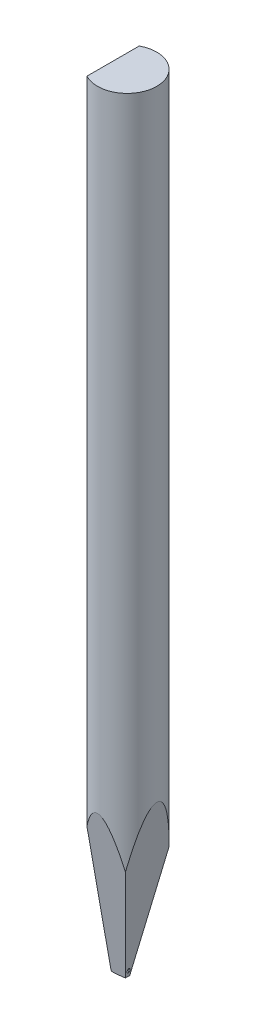
ISO-10303-21;
HEADER;
FILE_DESCRIPTION(('STEP AP214'),'2;1');
FILE_NAME('part.step','',(''),(''),'','','');
FILE_SCHEMA(('AUTOMOTIVE_DESIGN { 1 0 10303 214 1 1 1 1 }'));
ENDSEC;
DATA;
#1=APPLICATION_CONTEXT('core data for automotive mechanical design processes');
#2=APPLICATION_PROTOCOL_DEFINITION('international standard','automotive_design',2000,#1);
#3=PRODUCT_CONTEXT('',#1,'mechanical');
#4=PRODUCT('Part','Part','',(#3));
#5=PRODUCT_RELATED_PRODUCT_CATEGORY('part','',(#4));
#6=PRODUCT_DEFINITION_FORMATION('','',#4);
#7=PRODUCT_DEFINITION_CONTEXT('part definition',#1,'design');
#8=PRODUCT_DEFINITION('design','',#6,#7);
#9=PRODUCT_DEFINITION_SHAPE('','',#8);
#10=(LENGTH_UNIT() NAMED_UNIT(*) SI_UNIT(.MILLI.,.METRE.));
#11=(NAMED_UNIT(*) PLANE_ANGLE_UNIT() SI_UNIT($,.RADIAN.));
#12=(NAMED_UNIT(*) SI_UNIT($,.STERADIAN.) SOLID_ANGLE_UNIT());
#13=UNCERTAINTY_MEASURE_WITH_UNIT(LENGTH_MEASURE(1.E-05),#10,'distance_accuracy_value','');
#14=(GEOMETRIC_REPRESENTATION_CONTEXT(3) GLOBAL_UNCERTAINTY_ASSIGNED_CONTEXT((#13)) GLOBAL_UNIT_ASSIGNED_CONTEXT((#10,
#11,#12)) REPRESENTATION_CONTEXT('',''));
#15=CARTESIAN_POINT('',(0.,0.,0.));
#16=DIRECTION('',(0.,0.,1.));
#17=DIRECTION('',(1.,0.,0.));
#18=AXIS2_PLACEMENT_3D('',#15,#16,#17);
#19=CARTESIAN_POINT('',(-0.24892,0.,27.2760283406468));
#20=DIRECTION('',(-0.139173100960066,0.99026806874157,0.));
#21=DIRECTION('',(-0.99026806874157,-0.139173100960066,0.));
#22=AXIS2_PLACEMENT_3D('',#19,#20,#21);
#23=PLANE('',#22);
#24=DIRECTION('',(-0.99026806874157,-0.139173100960066,0.));
#25=VECTOR('',#24,1.);
#26=CARTESIAN_POINT('',(-0.24892,0.,0.0253999999999983));
#27=LINE('',#26,#25);
#28=CARTESIAN_POINT('',(-0.127,0.0171347385669156,0.0253999999999992));
#29=VERTEX_POINT('',#28);
#30=CARTESIAN_POINT('',(-0.229291435266472,0.00275861487165983,0.0254));
#31=VERTEX_POINT('',#30);
#32=EDGE_CURVE('E183',#29,#31,#27,.T.);
#33=ORIENTED_EDGE('',*,*,#32,.F.);
#34=DIRECTION('',(0.,0.,1.));
#35=VECTOR('',#34,1.);
#36=CARTESIAN_POINT('',(-0.127,0.0171347385669156,27.2760283406468));
#37=LINE('',#36,#35);
#38=CARTESIAN_POINT('',(-0.127,0.0171347385669156,-0.0253999999999992));
#39=VERTEX_POINT('',#38);
#40=EDGE_CURVE('E11',#39,#29,#37,.T.);
#41=ORIENTED_EDGE('',*,*,#40,.F.);
#42=DIRECTION('',(-0.99026806874157,-0.139173100960066,0.));
#43=VECTOR('',#42,1.);
#44=CARTESIAN_POINT('',(-0.24892,0.,-0.0253999999999983));
#45=LINE('',#44,#43);
#46=CARTESIAN_POINT('',(-0.229291435266472,0.00275861487165983,-0.0254));
#47=VERTEX_POINT('',#46);
#48=EDGE_CURVE('E147',#39,#47,#45,.T.);
#49=ORIENTED_EDGE('',*,*,#48,.T.);
#50=CARTESIAN_POINT('',(-2.40864817183527,-0.30353,0.));
#51=DIRECTION('',(-0.139173100960066,0.99026806874157,0.));
#52=DIRECTION('',(-0.99026806874157,-0.139173100960066,0.));
#53=AXIS2_PLACEMENT_3D('',#50,#51,#52);
#54=ELLIPSE('',#53,2.20832903686027,0.30734);
#55=CARTESIAN_POINT('',(-0.24892,0.,-0.0482432865795852));
#56=VERTEX_POINT('',#55);
#57=EDGE_CURVE('E189',#47,#56,#54,.T.);
#58=ORIENTED_EDGE('',*,*,#57,.T.);
#59=DIRECTION('',(0.,0.,-1.));
#60=VECTOR('',#59,1.);
#61=CARTESIAN_POINT('',(-0.24892,0.,27.2760283406468));
#62=LINE('',#61,#60);
#63=CARTESIAN_POINT('',(-0.248920000000001,0.,-0.0508000000000001));
#64=VERTEX_POINT('',#63);
#65=EDGE_CURVE('E207',#56,#64,#62,.T.);
#66=ORIENTED_EDGE('',*,*,#65,.T.);
#67=DIRECTION('',(0.98997002855162,0.139131214142995,-0.0245325869121374));
#68=VECTOR('',#67,1.);
#69=CARTESIAN_POINT('',(26.3325188531676,3.73577760401477,-0.709518385514232));
#70=LINE('',#69,#68);
#71=CARTESIAN_POINT('',(0.0115343561363234,0.0366044726132731,-0.0572543561363242));
#72=VERTEX_POINT('',#71);
#73=EDGE_CURVE('E249',#64,#72,#70,.T.);
#74=ORIENTED_EDGE('',*,*,#73,.T.);
#75=DIRECTION('',(0.,0.,-1.));
#76=VECTOR('',#75,1.);
#77=CARTESIAN_POINT('',(0.0115343561363241,0.036604472613273,27.2760283406468));
#78=LINE('',#77,#76);
#79=CARTESIAN_POINT('',(0.0115343561363234,0.0366044726132731,0.0572543561363242));
#80=VERTEX_POINT('',#79);
#81=EDGE_CURVE('E204',#80,#72,#78,.T.);
#82=ORIENTED_EDGE('',*,*,#81,.F.);
#83=DIRECTION('',(-0.98997002855162,-0.139131214142995,-0.0245325869121374));
#84=VECTOR('',#83,1.);
#85=CARTESIAN_POINT('',(26.3325188531676,3.73577760401477,0.709518385514232));
#86=LINE('',#85,#84);
#87=CARTESIAN_POINT('',(-0.248920000000001,0.,0.0508000000000001));
#88=VERTEX_POINT('',#87);
#89=EDGE_CURVE('E217',#80,#88,#86,.T.);
#90=ORIENTED_EDGE('',*,*,#89,.T.);
#91=CARTESIAN_POINT('',(-0.24892,0.,0.0482432865795852));
#92=VERTEX_POINT('',#91);
#93=EDGE_CURVE('E208',#88,#92,#62,.T.);
#94=ORIENTED_EDGE('',*,*,#93,.T.);
#95=EDGE_CURVE('E191',#92,#31,#54,.T.);
#96=ORIENTED_EDGE('',*,*,#95,.T.);
#97=EDGE_LOOP('',(#33,#41,#49,#58,#66,#74,#82,#90,#94,#96));
#98=FACE_BOUND('',#97,.T.);
#99=ADVANCED_FACE('F43',(#98),#23,.F.);
#100=CARTESIAN_POINT('',(26.8421219491216,-0.30353,0.));
#101=DIRECTION('',(-1.,0.,0.));
#102=DIRECTION('',(0.,0.,1.));
#103=AXIS2_PLACEMENT_3D('',#100,#101,#102);
#104=CYLINDRICAL_SURFACE('',#103,0.30734);
#105=DIRECTION('',(-1.,0.,0.));
#106=VECTOR('',#105,1.);
#107=CARTESIAN_POINT('',(26.8421219491216,0.00275861487165983,0.0254));
#108=LINE('',#107,#106);
#109=CARTESIAN_POINT('',(-0.263296988873611,0.00275861487166304,0.0254));
#110=VERTEX_POINT('',#109);
#111=EDGE_CURVE('E51',#31,#110,#108,.T.);
#112=ORIENTED_EDGE('',*,*,#111,.F.);
#113=ORIENTED_EDGE('',*,*,#95,.F.);
#114=DIRECTION('',(-1.,0.,0.));
#115=VECTOR('',#114,1.);
#116=CARTESIAN_POINT('',(26.8421219491216,0.,0.0482432865795852));
#117=LINE('',#116,#115);
#118=CARTESIAN_POINT('',(-0.35052,0.,0.0482432865795794));
#119=VERTEX_POINT('',#118);
#120=EDGE_CURVE('E66',#92,#119,#117,.T.);
#121=ORIENTED_EDGE('',*,*,#120,.T.);
#122=CARTESIAN_POINT('',(-0.35052,0.,-0.0482432865795922));
#123=CARTESIAN_POINT('',(-0.350767913301095,-1.1954284377854E-07,-0.048243986655547));
#124=CARTESIAN_POINT('',(-0.351014861392933,3.62470794983104E-06,-0.048220483758382));
#125=CARTESIAN_POINT('',(-0.351497824475881,1.77257610530524E-05,-0.0481316635507885));
#126=CARTESIAN_POINT('',(-0.351733938449228,2.79980345508149E-05,-0.0480668807295797));
#127=CARTESIAN_POINT('',(-0.352256326088675,5.7700596975821E-05,-0.0478789541586123));
#128=CARTESIAN_POINT('',(-0.352538394385228,7.88787351782363E-05,-0.047744619946916));
#129=CARTESIAN_POINT('',(-0.353078295346922,0.000127703558985957,-0.0474331108524054));
#130=CARTESIAN_POINT('',(-0.353335984553504,0.000155385552449555,-0.0472557019452803));
#131=CARTESIAN_POINT('',(-0.35400174233734,0.000236174594357564,-0.0467343071530911));
#132=CARTESIAN_POINT('',(-0.354386489991853,0.000293366747035748,-0.04636155839518));
#133=CARTESIAN_POINT('',(-0.355098951579075,0.000413574680164979,-0.0455669319559005));
#134=CARTESIAN_POINT('',(-0.355426537167256,0.000476603091413922,-0.0451449471799635));
#135=CARTESIAN_POINT('',(-0.356612086855197,0.000724574718518985,-0.0434579803018282));
#136=CARTESIAN_POINT('',(-0.357318341338529,0.000917424822642262,-0.0420900984298431));
#137=CARTESIAN_POINT('',(-0.358546499103956,0.00129385703696158,-0.0392733364497363));
#138=CARTESIAN_POINT('',(-0.359067131306758,0.00147736813627271,-0.0378239736930998));
#139=CARTESIAN_POINT('',(-0.361082963556257,0.00223677886764565,-0.0314441024489371));
#140=CARTESIAN_POINT('',(-0.361998491462296,0.00272303861932417,-0.0263250556700667));
#141=CARTESIAN_POINT('',(-0.363287466260709,0.00343648568054139,-0.0160225561821167));
#142=CARTESIAN_POINT('',(-0.363659578270333,0.00366303472730859,-0.0108389763128923));
#143=CARTESIAN_POINT('',(-0.363972985043323,0.0038533013861436,-0.000449493392455334));
#144=CARTESIAN_POINT('',(-0.363914353724791,0.00381706409391488,0.0047564056754146));
#145=CARTESIAN_POINT('',(-0.363359645903478,0.00348101396992449,0.0151346555748685));
#146=CARTESIAN_POINT('',(-0.362863906204432,0.00318140407435992,0.0203070291482927));
#147=CARTESIAN_POINT('',(-0.361587863461912,0.00253284401461593,0.0281196828661384));
#148=CARTESIAN_POINT('',(-0.361052170464872,0.00227386598671672,0.0308032472057591));
#149=CARTESIAN_POINT('',(-0.359879874536833,0.00178202258087566,0.035298540975975));
#150=CARTESIAN_POINT('',(-0.359320212463204,0.00156415994286525,0.037132976562585));
#151=CARTESIAN_POINT('',(-0.357915449615094,0.00108653420359277,0.0408693960879644));
#152=CARTESIAN_POINT('',(-0.357051905851088,0.000824845821214569,0.0427659366927868));
#153=CARTESIAN_POINT('',(-0.355666955135468,0.000526022910361374,0.0448100132221754));
#154=CARTESIAN_POINT('',(-0.355427139387405,0.000477218188451427,0.0451397061499284));
#155=CARTESIAN_POINT('',(-0.354916645564496,0.000382020953423657,0.0457761949331294));
#156=CARTESIAN_POINT('',(-0.35464590420184,0.00033563368038394,0.0460829416292439));
#157=CARTESIAN_POINT('',(-0.354064289185938,0.000246758191852077,0.0466652445212367));
#158=CARTESIAN_POINT('',(-0.353752942125968,0.000204328109507224,0.046940346423817));
#159=CARTESIAN_POINT('',(-0.353086480397466,0.000127793869629602,0.0474329155161212));
#160=CARTESIAN_POINT('',(-0.352731561443883,9.36543940548731E-05,0.0476506275388511));
#161=CARTESIAN_POINT('',(-0.352132978988947,5.02841505668838E-05,0.0479259603811172));
#162=CARTESIAN_POINT('',(-0.351903112512633,3.65754200280905E-05,0.0480126464944076));
#163=CARTESIAN_POINT('',(-0.351432234922693,1.53075235903079E-05,0.0481469291864223));
#164=CARTESIAN_POINT('',(-0.351191258260091,7.73054276190169E-06,0.0481946390090961));
#165=CARTESIAN_POINT('',(-0.350805892270718,1.19685939589671E-06,0.0482357533750448));
#166=CARTESIAN_POINT('',(-0.350662956582401,-3.31045745124852E-08,0.04824348277755));
#167=CARTESIAN_POINT('',(-0.350520000000001,0.,0.0482432865795857));
#168=B_SPLINE_CURVE_WITH_KNOTS('',3,(#122,#123,#124,#125,#126,#127,#128,#129,#130,#131,#132,
#133,#134,#135,#136,#137,#138,#139,#140,#141,#142,#143,#144,#145,#146,#147,#148,#149,#150,#151,
#152,#153,#154,#155,#156,#157,#158,#159,#160,#161,#162,#163,#164,#165,#166,#167),.UNSPECIFIED.,
.F.,.F.,(4,2,2,2,2,2,2,2,2,2,2,2,2,2,2,2,2,2,2,2,2,2,4),(0.,0.000741043318305509,
0.00147268140779471,0.00240682725086905,0.00334616655925005,0.00495326023235513,
0.00656391709747349,0.0111818210056003,0.0158307654682399,0.0313880221471919,0.0469834307890319,
0.0625761632290504,0.0781568915394562,0.0863865542979414,0.0921775559521106,0.0984081610415071,
0.0996385359492031,0.100871475463097,0.102120347956795,0.103363803055086,0.10409917629346,
0.104832405260402,0.105261095012052),.UNSPECIFIED.);
#169=CARTESIAN_POINT('',(-0.350519999999986,0.,-0.0482432865795852));
#170=VERTEX_POINT('',#169);
#171=EDGE_CURVE('E255',#170,#119,#168,.T.);
#172=ORIENTED_EDGE('',*,*,#171,.F.);
#173=DIRECTION('',(-1.,0.,0.));
#174=VECTOR('',#173,1.);
#175=CARTESIAN_POINT('',(26.8421219491216,0.,-0.0482432865795852));
#176=LINE('',#175,#174);
#177=EDGE_CURVE('E186',#56,#170,#176,.T.);
#178=ORIENTED_EDGE('',*,*,#177,.F.);
#179=ORIENTED_EDGE('',*,*,#57,.F.);
#180=DIRECTION('',(-1.,0.,0.));
#181=VECTOR('',#180,1.);
#182=CARTESIAN_POINT('',(26.8421219491216,0.00275861487165983,-0.0254));
#183=LINE('',#182,#181);
#184=CARTESIAN_POINT('',(-0.263296988873611,0.00275861487166211,-0.0254));
#185=VERTEX_POINT('',#184);
#186=EDGE_CURVE('E263',#47,#185,#183,.T.);
#187=ORIENTED_EDGE('',*,*,#186,.T.);
#188=CARTESIAN_POINT('',(-0.263296988873615,0.00275861487166541,-0.0254));
#189=CARTESIAN_POINT('',(-0.265444430405985,0.00275787671528225,-0.0253998771308304));
#190=CARTESIAN_POINT('',(-0.267597732028354,0.00277298530645061,-0.0252260953476512));
#191=CARTESIAN_POINT('',(-0.271856159600567,0.00283121514116066,-0.0245140453953919));
#192=CARTESIAN_POINT('',(-0.273960891965895,0.002874513966082,-0.0239734657049874));
#193=CARTESIAN_POINT('',(-0.277621450558486,0.00297415080728848,-0.0226581646183291));
#194=CARTESIAN_POINT('',(-0.279202223395719,0.00302608298732994,-0.0219528740536527));
#195=CARTESIAN_POINT('',(-0.282224279791113,0.00314031874074109,-0.020294996738451));
#196=CARTESIAN_POINT('',(-0.2836659614516,0.0032025912365653,-0.019343146355839));
#197=CARTESIAN_POINT('',(-0.286136351426538,0.00332011935603135,-0.0173691432443158));
#198=CARTESIAN_POINT('',(-0.28719411931051,0.00337487582877369,-0.0163834060277853));
#199=CARTESIAN_POINT('',(-0.289133435386785,0.00348134304003128,-0.0142495600312407));
#200=CARTESIAN_POINT('',(-0.290014961277573,0.00353305339250982,-0.0131014307336158));
#201=CARTESIAN_POINT('',(-0.291564032014947,0.00362763657878561,-0.0106566504876356));
#202=CARTESIAN_POINT('',(-0.292230131024491,0.00367044903655593,-0.00935907216897192));
#203=CARTESIAN_POINT('',(-0.293300028293608,0.0037407949631982,-0.0066594395319361));
#204=CARTESIAN_POINT('',(-0.293704045068021,0.0037683411577385,-0.00525747333863506));
#205=CARTESIAN_POINT('',(-0.294191208474051,0.00380177700804993,-0.00257512047659103));
#206=CARTESIAN_POINT('',(-0.294307427080704,0.00380989467913992,-0.00130070779819515));
#207=CARTESIAN_POINT('',(-0.294310458738467,0.00381010307647609,0.00124816111540355));
#208=CARTESIAN_POINT('',(-0.294197359652917,0.00380219994111317,0.00252261714690147));
#209=CARTESIAN_POINT('',(-0.293761327057917,0.00377227202855003,0.00495889317186551));
#210=CARTESIAN_POINT('',(-0.29345079592914,0.00375108287767713,0.00612298167055895));
#211=CARTESIAN_POINT('',(-0.29264678761112,0.00369766813586478,0.00838554438941615));
#212=CARTESIAN_POINT('',(-0.292153296574228,0.00366544170956345,0.00948401363576038));
#213=CARTESIAN_POINT('',(-0.290979940775483,0.00359159572869652,0.0116366413861173));
#214=CARTESIAN_POINT('',(-0.290293056069098,0.00354963561612976,0.0126869416901583));
#215=CARTESIAN_POINT('',(-0.288770430851901,0.00346116467833494,0.0146727846946988));
#216=CARTESIAN_POINT('',(-0.287934633065107,0.00341465210522114,0.0156082830046169));
#217=CARTESIAN_POINT('',(-0.286034323531791,0.00331531896242708,0.0174580910740619));
#218=CARTESIAN_POINT('',(-0.284954419418413,0.00326240821162118,0.0183565395392816));
#219=CARTESIAN_POINT('',(-0.282677675190383,0.00316031129225174,0.0199899762242416));
#220=CARTESIAN_POINT('',(-0.281480778340052,0.00311112695154115,0.0207248845634112));
#221=CARTESIAN_POINT('',(-0.278792581688037,0.00301243060223684,0.0221404867419703));
#222=CARTESIAN_POINT('',(-0.277285581151682,0.00296424837308401,0.0227913928023827));
#223=CARTESIAN_POINT('',(-0.274194177115432,0.00288175486882891,0.0238748004063647));
#224=CARTESIAN_POINT('',(-0.272609709788392,0.00284745525547335,0.0243071184061134));
#225=CARTESIAN_POINT('',(-0.269734939528156,0.0028004733226307,0.0248914653993343));
#226=CARTESIAN_POINT('',(-0.268452513348957,0.00278476835336049,0.0250832300682597));
#227=CARTESIAN_POINT('',(-0.265878958116572,0.00276381915932508,0.0253372121777127));
#228=CARTESIAN_POINT('',(-0.264587871042221,0.00275854101257999,0.0253998497414434));
#229=CARTESIAN_POINT('',(-0.263296988875001,0.00275861487110465,0.0254000000067783));
#230=B_SPLINE_CURVE_WITH_KNOTS('',3,(#188,#189,#190,#191,#192,#193,#194,#195,#196,#197,#198,
#199,#200,#201,#202,#203,#204,#205,#206,#207,#208,#209,#210,#211,#212,#213,#214,#215,#216,#217,
#218,#219,#220,#221,#222,#223,#224,#225,#226,#227,#228,#229),.UNSPECIFIED.,.F.,.F.,(4,2,2,2,2,2,
2,2,2,2,2,2,2,2,2,2,2,2,2,2,4),(0.,0.00644508279910896,0.0129311637490576,0.0181059616421331,
0.0232654793449091,0.0275885263307984,0.0319121200056632,0.0362641566953633,0.0406125601319729,
0.0444316470545828,0.0482492709661122,0.0518480159838007,0.0554470334345733,0.0591987706886136,
0.0629519540893285,0.0671531844215516,0.0713564623468416,0.0762650208194602,0.08117769408951,
0.0850616737339232,0.0889329965320814),.UNSPECIFIED.);
#231=EDGE_CURVE('E278',#185,#110,#230,.T.);
#232=ORIENTED_EDGE('',*,*,#231,.T.);
#233=EDGE_LOOP('',(#112,#113,#121,#172,#178,#179,#187,#232));
#234=FACE_BOUND('',#233,.T.);
#235=ADVANCED_FACE('F268',(#234),#104,.F.);
#236=CARTESIAN_POINT('',(0.,0.,0.));
#237=DIRECTION('',(0.,1.,0.));
#238=DIRECTION('',(0.,0.,1.));
#239=AXIS2_PLACEMENT_3D('',#236,#237,#238);
#240=PLANE('',#239);
#241=ORIENTED_EDGE('',*,*,#120,.F.);
#242=ORIENTED_EDGE('',*,*,#93,.F.);
#243=DIRECTION('',(-1.,0.,0.));
#244=VECTOR('',#243,1.);
#245=CARTESIAN_POINT('',(26.8738719491216,0.,0.0508));
#246=LINE('',#245,#244);
#247=CARTESIAN_POINT('',(-0.35052,0.,0.0507999999999983));
#248=VERTEX_POINT('',#247);
#249=EDGE_CURVE('E220',#88,#248,#246,.T.);
#250=ORIENTED_EDGE('',*,*,#249,.T.);
#251=DIRECTION('',(0.,0.,-1.));
#252=VECTOR('',#251,1.);
#253=CARTESIAN_POINT('',(-0.35052,0.,26.4674719491216));
#254=LINE('',#253,#252);
#255=EDGE_CURVE('E195',#248,#119,#254,.T.);
#256=ORIENTED_EDGE('',*,*,#255,.T.);
#257=EDGE_LOOP('',(#241,#242,#250,#256));
#258=FACE_BOUND('',#257,.T.);
#259=ADVANCED_FACE('F272',(#258),#240,.F.);
#260=CARTESIAN_POINT('',(26.8738719491216,0.,0.0508));
#261=DIRECTION('',(0.,-0.173648177666931,0.984807753012208));
#262=DIRECTION('',(0.,-0.984807753012208,-0.173648177666931));
#263=AXIS2_PLACEMENT_3D('',#260,#261,#262);
#264=PLANE('',#263);
#265=CARTESIAN_POINT('',(-0.35052,0.0254,0.0552787053099933));
#266=DIRECTION('',(0.,-0.173648177666931,0.984807753012208));
#267=DIRECTION('',(0.,-0.984807753012208,-0.173648177666931));
#268=AXIS2_PLACEMENT_3D('',#265,#266,#267);
#269=ELLIPSE('',#268,0.0257918359418979,0.0254);
#270=CARTESIAN_POINT('',(-0.37592,0.0254,0.0552787053099933));
#271=VERTEX_POINT('',#270);
#272=EDGE_CURVE('E198',#248,#271,#269,.F.);
#273=ORIENTED_EDGE('',*,*,#272,.F.);
#274=ORIENTED_EDGE('',*,*,#249,.F.);
#275=ORIENTED_EDGE('',*,*,#89,.F.);
#276=DIRECTION('',(-0.171087869746036,-0.970287525247814,-0.171087869746036));
#277=VECTOR('',#276,1.);
#278=CARTESIAN_POINT('',(0.791557999082988,4.46033837772866,0.837277999082991));
#279=LINE('',#278,#277);
#280=CARTESIAN_POINT('',(0.537041505266772,3.01690361355591,0.582761505266774));
#281=VERTEX_POINT('',#280);
#282=EDGE_CURVE('E214',#281,#80,#279,.T.);
#283=ORIENTED_EDGE('',*,*,#282,.F.);
#284=CARTESIAN_POINT('',(0.,-0.288101116436578,0.));
#285=DIRECTION('',(0.,-0.173648177666931,0.984807753012208));
#286=DIRECTION('',(0.,-0.984807753012208,-0.173648177666931));
#287=AXIS2_PLACEMENT_3D('',#284,#285,#286);
#288=ELLIPSE('',#287,4.56371043248163,0.792479999999998);
#289=CARTESIAN_POINT('',(-0.37592,3.66844093071414,0.69764511322018));
#290=VERTEX_POINT('',#289);
#291=EDGE_CURVE('E226',#281,#290,#288,.T.);
#292=ORIENTED_EDGE('',*,*,#291,.T.);
#293=DIRECTION('',(0.,0.984807753012208,0.173648177666931));
#294=VECTOR('',#293,1.);
#295=CARTESIAN_POINT('',(-0.37592,20.2093857917021,3.6142599786234));
#296=LINE('',#295,#294);
#297=EDGE_CURVE('E241',#271,#290,#296,.T.);
#298=ORIENTED_EDGE('',*,*,#297,.F.);
#299=EDGE_LOOP('',(#273,#274,#275,#283,#292,#298));
#300=FACE_BOUND('',#299,.T.);
#301=ADVANCED_FACE('F304',(#300),#264,.T.);
#302=CARTESIAN_POINT('',(26.8738719491216,0.,-0.0508));
#303=DIRECTION('',(0.,-0.173648177666931,-0.984807753012208));
#304=DIRECTION('',(0.,0.984807753012208,-0.173648177666931));
#305=AXIS2_PLACEMENT_3D('',#302,#303,#304);
#306=PLANE('',#305);
#307=CARTESIAN_POINT('',(-0.35052,0.0254,-0.0552787053099933));
#308=DIRECTION('',(0.,-0.173648177666931,-0.984807753012208));
#309=DIRECTION('',(0.,0.984807753012208,-0.173648177666931));
#310=AXIS2_PLACEMENT_3D('',#307,#308,#309);
#311=ELLIPSE('',#310,0.0257918359418979,0.0254);
#312=CARTESIAN_POINT('',(-0.37592,0.0254,-0.0552787053099933));
#313=VERTEX_POINT('',#312);
#314=CARTESIAN_POINT('',(-0.35052,0.,-0.0508000000000002));
#315=VERTEX_POINT('',#314);
#316=EDGE_CURVE('E252',#313,#315,#311,.F.);
#317=ORIENTED_EDGE('',*,*,#316,.F.);
#318=DIRECTION('',(0.,-0.984807753012208,0.173648177666931));
#319=VECTOR('',#318,1.);
#320=CARTESIAN_POINT('',(-0.37592,20.5673030312895,-3.67737044482337));
#321=LINE('',#320,#319);
#322=CARTESIAN_POINT('',(-0.37592,3.66844093071414,-0.69764511322018));
#323=VERTEX_POINT('',#322);
#324=EDGE_CURVE('E243',#323,#313,#321,.T.);
#325=ORIENTED_EDGE('',*,*,#324,.F.);
#326=CARTESIAN_POINT('',(0.,-0.288101116436578,0.));
#327=DIRECTION('',(0.,-0.173648177666931,-0.984807753012208));
#328=DIRECTION('',(0.,-0.984807753012208,0.173648177666931));
#329=AXIS2_PLACEMENT_3D('',#326,#327,#328);
#330=ELLIPSE('',#329,4.56371043248163,0.792479999999998);
#331=CARTESIAN_POINT('',(0.537041505266772,3.01690361355591,-0.582761505266774));
#332=VERTEX_POINT('',#331);
#333=EDGE_CURVE('E229',#323,#332,#330,.T.);
#334=ORIENTED_EDGE('',*,*,#333,.T.);
#335=DIRECTION('',(0.171087869746036,0.970287525247814,-0.171087869746036));
#336=VECTOR('',#335,1.);
#337=CARTESIAN_POINT('',(0.791557999082988,4.46033837772866,-0.837277999082991));
#338=LINE('',#337,#336);
#339=EDGE_CURVE('E246',#72,#332,#338,.T.);
#340=ORIENTED_EDGE('',*,*,#339,.F.);
#341=ORIENTED_EDGE('',*,*,#73,.F.);
#342=DIRECTION('',(-1.,0.,0.));
#343=VECTOR('',#342,1.);
#344=CARTESIAN_POINT('',(26.8738719491216,0.,-0.0508));
#345=LINE('',#344,#343);
#346=EDGE_CURVE('E223',#64,#315,#345,.T.);
#347=ORIENTED_EDGE('',*,*,#346,.T.);
#348=EDGE_LOOP('',(#317,#325,#334,#340,#341,#347));
#349=FACE_BOUND('',#348,.T.);
#350=ADVANCED_FACE('F312',(#349),#306,.T.);
#351=ORIENTED_EDGE('',*,*,#65,.F.);
#352=ORIENTED_EDGE('',*,*,#177,.T.);
#353=EDGE_CURVE('E199',#170,#315,#254,.T.);
#354=ORIENTED_EDGE('',*,*,#353,.T.);
#355=ORIENTED_EDGE('',*,*,#346,.F.);
#356=EDGE_LOOP('',(#351,#352,#354,#355));
#357=FACE_BOUND('',#356,.T.);
#358=ADVANCED_FACE('F314',(#357),#240,.F.);
#359=CARTESIAN_POINT('',(0.,21.0312,0.));
#360=DIRECTION('',(0.,-1.,0.));
#361=DIRECTION('',(0.,0.,-1.));
#362=AXIS2_PLACEMENT_3D('',#359,#360,#361);
#363=CYLINDRICAL_SURFACE('',#362,0.792479999999998);
#364=ORIENTED_EDGE('',*,*,#291,.F.);
#365=CARTESIAN_POINT('',(0.,-0.0288101116436568,0.));
#366=DIRECTION('',(-0.984807753012208,0.173648177666931,0.));
#367=DIRECTION('',(-0.173648177666931,-0.984807753012208,0.));
#368=AXIS2_PLACEMENT_3D('',#365,#366,#367);
#369=ELLIPSE('',#368,4.56371043248164,0.792479999999998);
#370=EDGE_CURVE('E211',#281,#332,#369,.T.);
#371=ORIENTED_EDGE('',*,*,#370,.T.);
#372=ORIENTED_EDGE('',*,*,#333,.F.);
#373=DIRECTION('',(0.,-1.,0.));
#374=VECTOR('',#373,1.);
#375=CARTESIAN_POINT('',(-0.37592,21.0312,-0.69764511322018));
#376=LINE('',#375,#374);
#377=CARTESIAN_POINT('',(-0.37592,21.0312,-0.69764511322018));
#378=VERTEX_POINT('',#377);
#379=EDGE_CURVE('E235',#378,#323,#376,.T.);
#380=ORIENTED_EDGE('',*,*,#379,.F.);
#381=CARTESIAN_POINT('',(0.,21.0312,0.));
#382=DIRECTION('',(0.,1.,0.));
#383=DIRECTION('',(0.,0.,1.));
#384=AXIS2_PLACEMENT_3D('',#381,#382,#383);
#385=CIRCLE('',#384,0.792479999999998);
#386=CARTESIAN_POINT('',(-0.37592,21.0312,0.69764511322018));
#387=VERTEX_POINT('',#386);
#388=EDGE_CURVE('E238',#387,#378,#385,.T.);
#389=ORIENTED_EDGE('',*,*,#388,.F.);
#390=DIRECTION('',(0.,-1.,0.));
#391=VECTOR('',#390,1.);
#392=CARTESIAN_POINT('',(-0.37592,21.0312,0.69764511322018));
#393=LINE('',#392,#391);
#394=EDGE_CURVE('E233',#290,#387,#393,.F.);
#395=ORIENTED_EDGE('',*,*,#394,.F.);
#396=EDGE_LOOP('',(#364,#371,#372,#380,#389,#395));
#397=FACE_BOUND('',#396,.T.);
#398=ADVANCED_FACE('F45',(#397),#363,.T.);
#399=CARTESIAN_POINT('',(-0.37592,21.0312,-1.04648));
#400=DIRECTION('',(-1.,0.,0.));
#401=DIRECTION('',(0.,0.,1.));
#402=AXIS2_PLACEMENT_3D('',#399,#400,#401);
#403=PLANE('',#402);
#404=DIRECTION('',(0.,0.,-1.));
#405=VECTOR('',#404,1.);
#406=CARTESIAN_POINT('',(-0.37592,0.0254,26.4674719491216));
#407=LINE('',#406,#405);
#408=EDGE_CURVE('E194',#271,#313,#407,.T.);
#409=ORIENTED_EDGE('',*,*,#408,.F.);
#410=ORIENTED_EDGE('',*,*,#297,.T.);
#411=ORIENTED_EDGE('',*,*,#394,.T.);
#412=DIRECTION('',(0.,0.,-1.));
#413=VECTOR('',#412,1.);
#414=CARTESIAN_POINT('',(-0.37592,21.0312,-1.04648));
#415=LINE('',#414,#413);
#416=EDGE_CURVE('E231',#387,#378,#415,.T.);
#417=ORIENTED_EDGE('',*,*,#416,.T.);
#418=ORIENTED_EDGE('',*,*,#379,.T.);
#419=ORIENTED_EDGE('',*,*,#324,.T.);
#420=EDGE_LOOP('',(#409,#410,#411,#417,#418,#419));
#421=FACE_BOUND('',#420,.T.);
#422=ADVANCED_FACE('F320',(#421),#403,.T.);
#423=CARTESIAN_POINT('',(0.,21.0312,0.));
#424=DIRECTION('',(0.,1.,0.));
#425=DIRECTION('',(0.,0.,1.));
#426=AXIS2_PLACEMENT_3D('',#423,#424,#425);
#427=PLANE('',#426);
#428=ORIENTED_EDGE('',*,*,#388,.T.);
#429=ORIENTED_EDGE('',*,*,#416,.F.);
#430=EDGE_LOOP('',(#428,#429));
#431=FACE_BOUND('',#430,.T.);
#432=ADVANCED_FACE('F293',(#431),#427,.T.);
#433=CARTESIAN_POINT('',(0.0115343561363241,0.036604472613273,27.2760283406468));
#434=DIRECTION('',(-0.984807753012208,0.173648177666931,0.));
#435=DIRECTION('',(-0.173648177666931,-0.984807753012208,0.));
#436=AXIS2_PLACEMENT_3D('',#433,#434,#435);
#437=PLANE('',#436);
#438=CARTESIAN_POINT('',(0.0384284330254712,0.189128361930093,0.));
#439=DIRECTION('',(-0.984807753012208,0.173648177666931,0.));
#440=DIRECTION('',(0.173648177666931,0.984807753012208,0.));
#441=AXIS2_PLACEMENT_3D('',#438,#439,#440);
#442=ELLIPSE('',#441,0.0566555398592854,0.0406948626453099);
#443=CARTESIAN_POINT('',(0.0482665642767722,0.24492317683461,0.));
#444=VERTEX_POINT('',#443);
#445=EDGE_CURVE('E185',#444,#444,#442,.F.);
#446=ORIENTED_EDGE('',*,*,#445,.F.);
#447=EDGE_LOOP('',(#446));
#448=FACE_BOUND('',#447,.T.);
#449=ORIENTED_EDGE('',*,*,#370,.F.);
#450=ORIENTED_EDGE('',*,*,#282,.T.);
#451=ORIENTED_EDGE('',*,*,#81,.T.);
#452=ORIENTED_EDGE('',*,*,#339,.T.);
#453=EDGE_LOOP('',(#449,#450,#451,#452));
#454=FACE_BOUND('',#453,.T.);
#455=ADVANCED_FACE('F290',(#448,#454),#437,.F.);
#456=CARTESIAN_POINT('',(-0.35052,0.0254,26.4674719491216));
#457=DIRECTION('',(0.,0.,-1.));
#458=DIRECTION('',(-1.,0.,0.));
#459=AXIS2_PLACEMENT_3D('',#456,#457,#458);
#460=CYLINDRICAL_SURFACE('',#459,0.0254);
#461=ORIENTED_EDGE('',*,*,#353,.F.);
#462=ORIENTED_EDGE('',*,*,#171,.T.);
#463=ORIENTED_EDGE('',*,*,#255,.F.);
#464=ORIENTED_EDGE('',*,*,#272,.T.);
#465=ORIENTED_EDGE('',*,*,#408,.T.);
#466=ORIENTED_EDGE('',*,*,#316,.T.);
#467=EDGE_LOOP('',(#461,#462,#463,#464,#465,#466));
#468=FACE_BOUND('',#467,.T.);
#469=ADVANCED_FACE('F265',(#468),#460,.T.);
#470=CARTESIAN_POINT('',(-0.127,0.0762000000000001,0.0254));
#471=DIRECTION('',(-1.,0.,0.));
#472=DIRECTION('',(0.,0.,1.));
#473=AXIS2_PLACEMENT_3D('',#470,#471,#472);
#474=PLANE('',#473);
#475=ORIENTED_EDGE('',*,*,#40,.T.);
#476=DIRECTION('',(0.,1.,0.));
#477=VECTOR('',#476,1.);
#478=CARTESIAN_POINT('',(-0.127,0.0762000000000001,0.0254));
#479=LINE('',#478,#477);
#480=CARTESIAN_POINT('',(-0.127,0.0762000000000001,0.0254));
#481=VERTEX_POINT('',#480);
#482=EDGE_CURVE('E157',#29,#481,#479,.T.);
#483=ORIENTED_EDGE('',*,*,#482,.T.);
#484=CARTESIAN_POINT('',(-0.127,0.0762000000000001,0.));
#485=DIRECTION('',(-1.,0.,0.));
#486=DIRECTION('',(0.,1.,0.));
#487=AXIS2_PLACEMENT_3D('',#484,#485,#486);
#488=ELLIPSE('',#487,0.0293293936748329,0.0254);
#489=CARTESIAN_POINT('',(-0.127,0.0762000000000001,-0.0254));
#490=VERTEX_POINT('',#489);
#491=EDGE_CURVE('E153',#481,#490,#488,.F.);
#492=ORIENTED_EDGE('',*,*,#491,.T.);
#493=DIRECTION('',(0.,1.,0.));
#494=VECTOR('',#493,1.);
#495=CARTESIAN_POINT('',(-0.127,0.0762000000000001,-0.0254));
#496=LINE('',#495,#494);
#497=EDGE_CURVE('E141',#39,#490,#496,.T.);
#498=ORIENTED_EDGE('',*,*,#497,.F.);
#499=EDGE_LOOP('',(#475,#483,#492,#498));
#500=FACE_BOUND('',#499,.T.);
#501=ADVANCED_FACE('F155',(#500),#474,.T.);
#502=CARTESIAN_POINT('',(0.00833549193050173,0.154335982696985,0.));
#503=DIRECTION('',(0.866025403784441,0.499999999999995,0.));
#504=DIRECTION('',(-0.499999999999995,0.866025403784441,0.));
#505=AXIS2_PLACEMENT_3D('',#502,#503,#504);
#506=CONICAL_SURFACE('',#505,0.0254,0.392699081698725);
#507=CARTESIAN_POINT('',(0.00833549193050173,0.154335982696985,0.));
#508=DIRECTION('',(0.866025403784441,0.499999999999995,0.));
#509=DIRECTION('',(-0.499999999999995,0.866025403784441,0.));
#510=AXIS2_PLACEMENT_3D('',#507,#508,#509);
#511=CIRCLE('',#510,0.0254);
#512=CARTESIAN_POINT('',(-0.00436450806949813,0.17633302795311,0.));
#513=VERTEX_POINT('',#512);
#514=EDGE_CURVE('E161',#513,#513,#511,.T.);
#515=ORIENTED_EDGE('',*,*,#514,.F.);
#516=EDGE_LOOP('',(#515));
#517=FACE_BOUND('',#516,.T.);
#518=ORIENTED_EDGE('',*,*,#445,.T.);
#519=EDGE_LOOP('',(#518));
#520=FACE_BOUND('',#519,.T.);
#521=ADVANCED_FACE('F288',(#517,#520),#506,.F.);
#522=CARTESIAN_POINT('',(-0.207954935664998,0.0762000000000001,0.));
#523=DIRECTION('',(-0.601815023152052,-0.79863551004729,0.));
#524=DIRECTION('',(0.79863551004729,-0.601815023152052,0.));
#525=AXIS2_PLACEMENT_3D('',#522,#523,#524);
#526=CYLINDRICAL_SURFACE('',#525,0.0254);
#527=DIRECTION('',(0.601815023152052,0.79863551004729,0.));
#528=VECTOR('',#527,1.);
#529=CARTESIAN_POINT('',(-0.207954935664998,0.0762000000000001,-0.0254));
#530=LINE('',#529,#528);
#531=CARTESIAN_POINT('',(-0.207954935664998,0.0762000000000001,-0.0254));
#532=VERTEX_POINT('',#531);
#533=EDGE_CURVE('E58',#185,#532,#530,.T.);
#534=ORIENTED_EDGE('',*,*,#533,.T.);
#535=CARTESIAN_POINT('',(-0.207954935664998,0.0762000000000001,0.));
#536=DIRECTION('',(0.,-1.,0.));
#537=DIRECTION('',(-1.,0.,0.));
#538=AXIS2_PLACEMENT_3D('',#535,#536,#537);
#539=ELLIPSE('',#538,0.0318042457171683,0.0254);
#540=CARTESIAN_POINT('',(-0.207954935664998,0.0762000000000001,0.0254));
#541=VERTEX_POINT('',#540);
#542=EDGE_CURVE('E170',#532,#541,#539,.F.);
#543=ORIENTED_EDGE('',*,*,#542,.T.);
#544=DIRECTION('',(-0.601815023152052,-0.79863551004729,0.));
#545=VECTOR('',#544,1.);
#546=CARTESIAN_POINT('',(-0.169261612745645,0.127547773811413,0.0254));
#547=LINE('',#546,#545);
#548=EDGE_CURVE('E177',#541,#110,#547,.T.);
#549=ORIENTED_EDGE('',*,*,#548,.T.);
#550=ORIENTED_EDGE('',*,*,#231,.F.);
#551=EDGE_LOOP('',(#534,#543,#549,#550));
#552=FACE_BOUND('',#551,.T.);
#553=ADVANCED_FACE('F274',(#552),#526,.F.);
#554=CARTESIAN_POINT('',(0.,0.,0.0254));
#555=DIRECTION('',(0.,0.,-1.));
#556=DIRECTION('',(-1.,0.,0.));
#557=AXIS2_PLACEMENT_3D('',#554,#555,#556);
#558=PLANE('',#557);
#559=ORIENTED_EDGE('',*,*,#32,.T.);
#560=ORIENTED_EDGE('',*,*,#111,.T.);
#561=ORIENTED_EDGE('',*,*,#548,.F.);
#562=DIRECTION('',(-1.,0.,0.));
#563=VECTOR('',#562,1.);
#564=CARTESIAN_POINT('',(-0.239759181382167,0.0762000000000001,0.0254));
#565=LINE('',#564,#563);
#566=EDGE_CURVE('E150',#481,#541,#565,.T.);
#567=ORIENTED_EDGE('',*,*,#566,.F.);
#568=ORIENTED_EDGE('',*,*,#482,.F.);
#569=EDGE_LOOP('',(#559,#560,#561,#567,#568));
#570=FACE_BOUND('',#569,.T.);
#571=ADVANCED_FACE('F437',(#570),#558,.T.);
#572=CARTESIAN_POINT('',(0.,0.,-0.0254));
#573=DIRECTION('',(0.,0.,-1.));
#574=DIRECTION('',(-1.,0.,0.));
#575=AXIS2_PLACEMENT_3D('',#572,#573,#574);
#576=PLANE('',#575);
#577=ORIENTED_EDGE('',*,*,#497,.T.);
#578=DIRECTION('',(-1.,0.,0.));
#579=VECTOR('',#578,1.);
#580=CARTESIAN_POINT('',(-0.239759181382167,0.0762000000000001,-0.0254));
#581=LINE('',#580,#579);
#582=EDGE_CURVE('E145',#490,#532,#581,.T.);
#583=ORIENTED_EDGE('',*,*,#582,.T.);
#584=ORIENTED_EDGE('',*,*,#533,.F.);
#585=ORIENTED_EDGE('',*,*,#186,.F.);
#586=ORIENTED_EDGE('',*,*,#48,.F.);
#587=EDGE_LOOP('',(#577,#583,#584,#585,#586));
#588=FACE_BOUND('',#587,.T.);
#589=ADVANCED_FACE('F143',(#588),#576,.F.);
#590=CARTESIAN_POINT('',(-0.239759181382167,0.0762000000000001,0.0254));
#591=DIRECTION('',(0.,-1.,0.));
#592=DIRECTION('',(1.,0.,0.));
#593=AXIS2_PLACEMENT_3D('',#590,#591,#592);
#594=PLANE('',#593);
#595=ORIENTED_EDGE('',*,*,#582,.F.);
#596=CARTESIAN_POINT('',(-0.127,0.0762000000000001,0.));
#597=DIRECTION('',(0.,-1.,0.));
#598=DIRECTION('',(1.,0.,0.));
#599=AXIS2_PLACEMENT_3D('',#596,#597,#598);
#600=ELLIPSE('',#599,0.0508000000000004,0.0254);
#601=EDGE_CURVE('E162',#490,#481,#600,.F.);
#602=ORIENTED_EDGE('',*,*,#601,.T.);
#603=ORIENTED_EDGE('',*,*,#566,.T.);
#604=ORIENTED_EDGE('',*,*,#542,.F.);
#605=EDGE_LOOP('',(#595,#602,#603,#604));
#606=FACE_BOUND('',#605,.T.);
#607=ADVANCED_FACE('F169',(#606),#594,.T.);
#608=CARTESIAN_POINT('',(-0.289362618691757,-0.017540101608017,0.));
#609=DIRECTION('',(0.866025403784441,0.499999999999995,0.));
#610=DIRECTION('',(-0.499999999999995,0.866025403784441,0.));
#611=AXIS2_PLACEMENT_3D('',#608,#609,#610);
#612=CYLINDRICAL_SURFACE('',#611,0.0254);
#613=ORIENTED_EDGE('',*,*,#514,.T.);
#614=EDGE_LOOP('',(#613));
#615=FACE_BOUND('',#614,.T.);
#616=ORIENTED_EDGE('',*,*,#491,.F.);
#617=ORIENTED_EDGE('',*,*,#601,.F.);
#618=EDGE_LOOP('',(#616,#617));
#619=FACE_BOUND('',#618,.T.);
#620=ADVANCED_FACE('F164',(#615,#619),#612,.F.);
#621=CLOSED_SHELL('',(#99,#235,#259,#301,#350,#358,#398,#422,#432,#455,#469,#501,#521,#553,#571,
#589,#607,#620));
#622=MANIFOLD_SOLID_BREP('B2',#621);
#623=ADVANCED_BREP_SHAPE_REPRESENTATION('',(#18,#622),#14);
#624=SHAPE_DEFINITION_REPRESENTATION(#9,#623);
ENDSEC;
END-ISO-10303-21;
